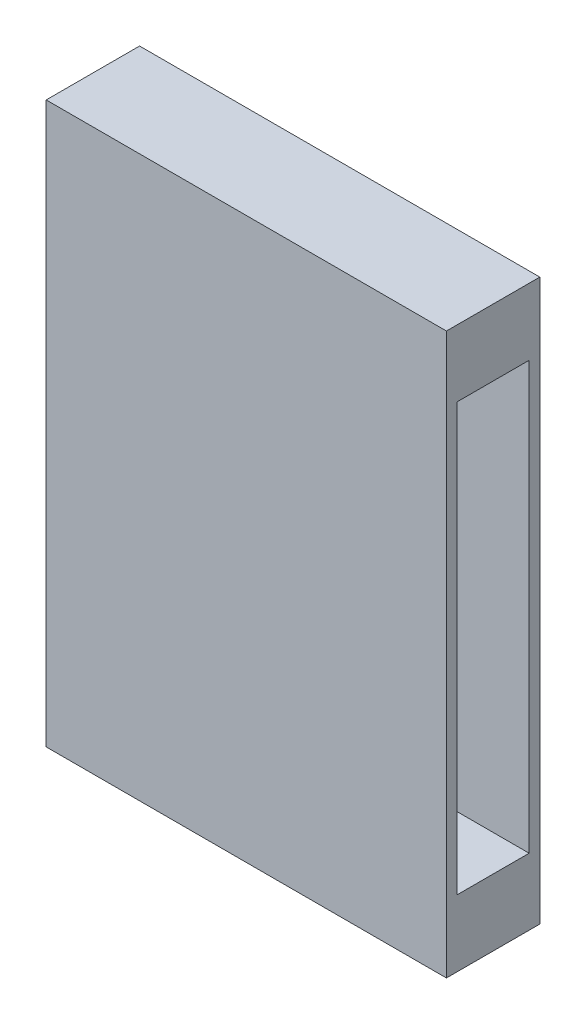
ISO-10303-21;
HEADER;
FILE_DESCRIPTION(('STEP AP214'),'2;1');
FILE_NAME('part.step','',(''),(''),'','','');
FILE_SCHEMA(('AUTOMOTIVE_DESIGN { 1 0 10303 214 1 1 1 1 }'));
ENDSEC;
DATA;
#1=APPLICATION_CONTEXT('core data for automotive mechanical design processes');
#2=APPLICATION_PROTOCOL_DEFINITION('international standard','automotive_design',2000,#1);
#3=PRODUCT_CONTEXT('',#1,'mechanical');
#4=PRODUCT('Part','Part','',(#3));
#5=PRODUCT_RELATED_PRODUCT_CATEGORY('part','',(#4));
#6=PRODUCT_DEFINITION_FORMATION('','',#4);
#7=PRODUCT_DEFINITION_CONTEXT('part definition',#1,'design');
#8=PRODUCT_DEFINITION('design','',#6,#7);
#9=PRODUCT_DEFINITION_SHAPE('','',#8);
#10=(LENGTH_UNIT() NAMED_UNIT(*) SI_UNIT(.MILLI.,.METRE.));
#11=(NAMED_UNIT(*) PLANE_ANGLE_UNIT() SI_UNIT($,.RADIAN.));
#12=(NAMED_UNIT(*) SI_UNIT($,.STERADIAN.) SOLID_ANGLE_UNIT());
#13=UNCERTAINTY_MEASURE_WITH_UNIT(LENGTH_MEASURE(1.E-05),#10,'distance_accuracy_value','');
#14=(GEOMETRIC_REPRESENTATION_CONTEXT(3) GLOBAL_UNCERTAINTY_ASSIGNED_CONTEXT((#13)) GLOBAL_UNIT_ASSIGNED_CONTEXT((#10,
#11,#12)) REPRESENTATION_CONTEXT('',''));
#15=CARTESIAN_POINT('',(0.,0.,0.));
#16=DIRECTION('',(0.,0.,1.));
#17=DIRECTION('',(1.,0.,0.));
#18=AXIS2_PLACEMENT_3D('',#15,#16,#17);
#19=CARTESIAN_POINT('',(21.,0.,0.));
#20=DIRECTION('',(-1.,0.,0.));
#21=DIRECTION('',(0.,0.,1.));
#22=AXIS2_PLACEMENT_3D('',#19,#20,#21);
#23=PLANE('',#22);
#24=DIRECTION('',(0.,0.,-1.));
#25=VECTOR('',#24,1.);
#26=CARTESIAN_POINT('',(21.,37.,0.));
#27=LINE('',#26,#25);
#28=CARTESIAN_POINT('',(21.,37.,6.2));
#29=VERTEX_POINT('',#28);
#30=CARTESIAN_POINT('',(21.,37.,0.800000000000005));
#31=VERTEX_POINT('',#30);
#32=EDGE_CURVE('E11',#29,#31,#27,.T.);
#33=ORIENTED_EDGE('',*,*,#32,.F.);
#34=DIRECTION('',(0.,1.,0.));
#35=VECTOR('',#34,1.);
#36=CARTESIAN_POINT('',(21.,0.8,6.2));
#37=LINE('',#36,#35);
#38=CARTESIAN_POINT('',(21.,41.2,6.2));
#39=VERTEX_POINT('',#38);
#40=EDGE_CURVE('E162',#29,#39,#37,.T.);
#41=ORIENTED_EDGE('',*,*,#40,.T.);
#42=DIRECTION('',(0.,0.,-1.));
#43=VECTOR('',#42,1.);
#44=CARTESIAN_POINT('',(21.,41.2,6.2));
#45=LINE('',#44,#43);
#46=CARTESIAN_POINT('',(21.,41.2,0.8));
#47=VERTEX_POINT('',#46);
#48=EDGE_CURVE('E152',#39,#47,#45,.T.);
#49=ORIENTED_EDGE('',*,*,#48,.T.);
#50=DIRECTION('',(0.,-1.,0.));
#51=VECTOR('',#50,1.);
#52=CARTESIAN_POINT('',(21.,41.2,0.8));
#53=LINE('',#52,#51);
#54=EDGE_CURVE('E156',#47,#31,#53,.T.);
#55=ORIENTED_EDGE('',*,*,#54,.T.);
#56=EDGE_LOOP('',(#33,#41,#49,#55));
#57=FACE_BOUND('',#56,.T.);
#58=ADVANCED_FACE('F35',(#57),#23,.T.);
#59=CARTESIAN_POINT('',(0.,0.,7.));
#60=DIRECTION('',(1.,0.,0.));
#61=DIRECTION('',(0.,0.,-1.));
#62=AXIS2_PLACEMENT_3D('',#59,#60,#61);
#63=PLANE('',#62);
#64=DIRECTION('',(0.,-1.,0.));
#65=VECTOR('',#64,1.);
#66=CARTESIAN_POINT('',(0.,41.2,0.8));
#67=LINE('',#66,#65);
#68=CARTESIAN_POINT('',(0.,41.2,0.799999999999999));
#69=VERTEX_POINT('',#68);
#70=CARTESIAN_POINT('',(0.,0.8,0.8));
#71=VERTEX_POINT('',#70);
#72=EDGE_CURVE('E168',#69,#71,#67,.T.);
#73=ORIENTED_EDGE('',*,*,#72,.F.);
#74=DIRECTION('',(0.,0.,-1.));
#75=VECTOR('',#74,1.);
#76=CARTESIAN_POINT('',(0.,41.2,6.2));
#77=LINE('',#76,#75);
#78=CARTESIAN_POINT('',(0.,41.2,6.2));
#79=VERTEX_POINT('',#78);
#80=EDGE_CURVE('E149',#79,#69,#77,.T.);
#81=ORIENTED_EDGE('',*,*,#80,.F.);
#82=DIRECTION('',(0.,1.,0.));
#83=VECTOR('',#82,1.);
#84=CARTESIAN_POINT('',(0.,0.8,6.2));
#85=LINE('',#84,#83);
#86=CARTESIAN_POINT('',(0.,0.8,6.2));
#87=VERTEX_POINT('',#86);
#88=EDGE_CURVE('E155',#87,#79,#85,.T.);
#89=ORIENTED_EDGE('',*,*,#88,.F.);
#90=DIRECTION('',(0.,0.,1.));
#91=VECTOR('',#90,1.);
#92=CARTESIAN_POINT('',(0.,0.8,0.8));
#93=LINE('',#92,#91);
#94=EDGE_CURVE('E171',#71,#87,#93,.T.);
#95=ORIENTED_EDGE('',*,*,#94,.F.);
#96=EDGE_LOOP('',(#73,#81,#89,#95));
#97=FACE_BOUND('',#96,.T.);
#98=DIRECTION('',(0.,-1.,0.));
#99=VECTOR('',#98,1.);
#100=CARTESIAN_POINT('',(0.,0.,0.));
#101=LINE('',#100,#99);
#102=CARTESIAN_POINT('',(0.,42.,0.));
#103=VERTEX_POINT('',#102);
#104=CARTESIAN_POINT('',(0.,0.,0.));
#105=VERTEX_POINT('',#104);
#106=EDGE_CURVE('E178',#103,#105,#101,.T.);
#107=ORIENTED_EDGE('',*,*,#106,.T.);
#108=DIRECTION('',(0.,0.,-1.));
#109=VECTOR('',#108,1.);
#110=CARTESIAN_POINT('',(0.,0.,7.));
#111=LINE('',#110,#109);
#112=CARTESIAN_POINT('',(0.,0.,7.));
#113=VERTEX_POINT('',#112);
#114=EDGE_CURVE('E211',#113,#105,#111,.T.);
#115=ORIENTED_EDGE('',*,*,#114,.F.);
#116=DIRECTION('',(0.,-1.,0.));
#117=VECTOR('',#116,1.);
#118=CARTESIAN_POINT('',(0.,0.,7.));
#119=LINE('',#118,#117);
#120=CARTESIAN_POINT('',(0.,42.,7.));
#121=VERTEX_POINT('',#120);
#122=EDGE_CURVE('E185',#121,#113,#119,.T.);
#123=ORIENTED_EDGE('',*,*,#122,.F.);
#124=DIRECTION('',(0.,0.,-1.));
#125=VECTOR('',#124,1.);
#126=CARTESIAN_POINT('',(0.,42.,7.));
#127=LINE('',#126,#125);
#128=EDGE_CURVE('E195',#121,#103,#127,.T.);
#129=ORIENTED_EDGE('',*,*,#128,.T.);
#130=EDGE_LOOP('',(#107,#115,#123,#129));
#131=FACE_BOUND('',#130,.T.);
#132=ADVANCED_FACE('F37',(#97,#131),#63,.F.);
#133=CARTESIAN_POINT('',(0.,0.,7.));
#134=DIRECTION('',(0.,1.,0.));
#135=DIRECTION('',(0.,0.,1.));
#136=AXIS2_PLACEMENT_3D('',#133,#134,#135);
#137=PLANE('',#136);
#138=DIRECTION('',(1.,0.,0.));
#139=VECTOR('',#138,1.);
#140=CARTESIAN_POINT('',(0.,0.,0.));
#141=LINE('',#140,#139);
#142=CARTESIAN_POINT('',(30.,0.,0.));
#143=VERTEX_POINT('',#142);
#144=EDGE_CURVE('E198',#105,#143,#141,.T.);
#145=ORIENTED_EDGE('',*,*,#144,.T.);
#146=DIRECTION('',(0.,0.,-1.));
#147=VECTOR('',#146,1.);
#148=CARTESIAN_POINT('',(30.,0.,7.));
#149=LINE('',#148,#147);
#150=CARTESIAN_POINT('',(30.,0.,7.));
#151=VERTEX_POINT('',#150);
#152=EDGE_CURVE('E208',#151,#143,#149,.T.);
#153=ORIENTED_EDGE('',*,*,#152,.F.);
#154=DIRECTION('',(1.,0.,0.));
#155=VECTOR('',#154,1.);
#156=CARTESIAN_POINT('',(0.,0.,7.));
#157=LINE('',#156,#155);
#158=EDGE_CURVE('E188',#113,#151,#157,.T.);
#159=ORIENTED_EDGE('',*,*,#158,.F.);
#160=ORIENTED_EDGE('',*,*,#114,.T.);
#161=EDGE_LOOP('',(#145,#153,#159,#160));
#162=FACE_BOUND('',#161,.T.);
#163=ADVANCED_FACE('F248',(#162),#137,.F.);
#164=CARTESIAN_POINT('',(30.,0.,7.));
#165=DIRECTION('',(-1.,0.,0.));
#166=DIRECTION('',(0.,0.,1.));
#167=AXIS2_PLACEMENT_3D('',#164,#165,#166);
#168=PLANE('',#167);
#169=DIRECTION('',(0.,0.,-1.));
#170=VECTOR('',#169,1.);
#171=CARTESIAN_POINT('',(30.,5.,6.2));
#172=LINE('',#171,#170);
#173=CARTESIAN_POINT('',(30.,5.,6.2));
#174=VERTEX_POINT('',#173);
#175=CARTESIAN_POINT('',(30.,5.,0.800000000000005));
#176=VERTEX_POINT('',#175);
#177=EDGE_CURVE('E135',#174,#176,#172,.T.);
#178=ORIENTED_EDGE('',*,*,#177,.F.);
#179=DIRECTION('',(0.,-1.,0.));
#180=VECTOR('',#179,1.);
#181=CARTESIAN_POINT('',(30.,37.,6.2));
#182=LINE('',#181,#180);
#183=CARTESIAN_POINT('',(30.,37.,6.2));
#184=VERTEX_POINT('',#183);
#185=EDGE_CURVE('E50',#184,#174,#182,.T.);
#186=ORIENTED_EDGE('',*,*,#185,.F.);
#187=DIRECTION('',(0.,0.,1.));
#188=VECTOR('',#187,1.);
#189=CARTESIAN_POINT('',(30.,37.,6.2));
#190=LINE('',#189,#188);
#191=CARTESIAN_POINT('',(30.,37.,0.800000000000005));
#192=VERTEX_POINT('',#191);
#193=EDGE_CURVE('E142',#192,#184,#190,.T.);
#194=ORIENTED_EDGE('',*,*,#193,.F.);
#195=DIRECTION('',(0.,1.,0.));
#196=VECTOR('',#195,1.);
#197=CARTESIAN_POINT('',(30.,37.,0.800000000000005));
#198=LINE('',#197,#196);
#199=EDGE_CURVE('E127',#176,#192,#198,.T.);
#200=ORIENTED_EDGE('',*,*,#199,.F.);
#201=EDGE_LOOP('',(#178,#186,#194,#200));
#202=FACE_BOUND('',#201,.T.);
#203=DIRECTION('',(0.,1.,0.));
#204=VECTOR('',#203,1.);
#205=CARTESIAN_POINT('',(30.,0.,0.));
#206=LINE('',#205,#204);
#207=CARTESIAN_POINT('',(30.,42.,0.));
#208=VERTEX_POINT('',#207);
#209=EDGE_CURVE('E200',#143,#208,#206,.T.);
#210=ORIENTED_EDGE('',*,*,#209,.T.);
#211=DIRECTION('',(0.,0.,-1.));
#212=VECTOR('',#211,1.);
#213=CARTESIAN_POINT('',(30.,42.,7.));
#214=LINE('',#213,#212);
#215=CARTESIAN_POINT('',(30.,42.,7.));
#216=VERTEX_POINT('',#215);
#217=EDGE_CURVE('E205',#216,#208,#214,.T.);
#218=ORIENTED_EDGE('',*,*,#217,.F.);
#219=DIRECTION('',(0.,1.,0.));
#220=VECTOR('',#219,1.);
#221=CARTESIAN_POINT('',(30.,0.,7.));
#222=LINE('',#221,#220);
#223=EDGE_CURVE('E191',#151,#216,#222,.T.);
#224=ORIENTED_EDGE('',*,*,#223,.F.);
#225=ORIENTED_EDGE('',*,*,#152,.T.);
#226=EDGE_LOOP('',(#210,#218,#224,#225));
#227=FACE_BOUND('',#226,.T.);
#228=ADVANCED_FACE('F139',(#202,#227),#168,.F.);
#229=CARTESIAN_POINT('',(0.,42.,7.));
#230=DIRECTION('',(0.,-1.,0.));
#231=DIRECTION('',(0.,0.,-1.));
#232=AXIS2_PLACEMENT_3D('',#229,#230,#231);
#233=PLANE('',#232);
#234=DIRECTION('',(-1.,0.,0.));
#235=VECTOR('',#234,1.);
#236=CARTESIAN_POINT('',(0.,42.,0.));
#237=LINE('',#236,#235);
#238=EDGE_CURVE('E189',#208,#103,#237,.T.);
#239=ORIENTED_EDGE('',*,*,#238,.T.);
#240=ORIENTED_EDGE('',*,*,#128,.F.);
#241=DIRECTION('',(-1.,0.,0.));
#242=VECTOR('',#241,1.);
#243=CARTESIAN_POINT('',(0.,42.,7.));
#244=LINE('',#243,#242);
#245=EDGE_CURVE('E193',#216,#121,#244,.T.);
#246=ORIENTED_EDGE('',*,*,#245,.F.);
#247=ORIENTED_EDGE('',*,*,#217,.T.);
#248=EDGE_LOOP('',(#239,#240,#246,#247));
#249=FACE_BOUND('',#248,.T.);
#250=ADVANCED_FACE('F262',(#249),#233,.F.);
#251=CARTESIAN_POINT('',(0.,0.,7.));
#252=DIRECTION('',(0.,0.,-1.));
#253=DIRECTION('',(-1.,0.,0.));
#254=AXIS2_PLACEMENT_3D('',#251,#252,#253);
#255=PLANE('',#254);
#256=ORIENTED_EDGE('',*,*,#122,.T.);
#257=ORIENTED_EDGE('',*,*,#158,.T.);
#258=ORIENTED_EDGE('',*,*,#223,.T.);
#259=ORIENTED_EDGE('',*,*,#245,.T.);
#260=EDGE_LOOP('',(#256,#257,#258,#259));
#261=FACE_BOUND('',#260,.T.);
#262=ADVANCED_FACE('F259',(#261),#255,.F.);
#263=CARTESIAN_POINT('',(0.,0.,0.));
#264=DIRECTION('',(0.,0.,-1.));
#265=DIRECTION('',(-1.,0.,0.));
#266=AXIS2_PLACEMENT_3D('',#263,#264,#265);
#267=PLANE('',#266);
#268=ORIENTED_EDGE('',*,*,#106,.F.);
#269=ORIENTED_EDGE('',*,*,#238,.F.);
#270=ORIENTED_EDGE('',*,*,#209,.F.);
#271=ORIENTED_EDGE('',*,*,#144,.F.);
#272=EDGE_LOOP('',(#268,#269,#270,#271));
#273=FACE_BOUND('',#272,.T.);
#274=ADVANCED_FACE('F258',(#273),#267,.T.);
#275=CARTESIAN_POINT('',(21.,41.2,6.2));
#276=DIRECTION('',(0.,1.,0.));
#277=DIRECTION('',(0.,0.,1.));
#278=AXIS2_PLACEMENT_3D('',#275,#276,#277);
#279=PLANE('',#278);
#280=ORIENTED_EDGE('',*,*,#80,.T.);
#281=DIRECTION('',(-1.,0.,0.));
#282=VECTOR('',#281,1.);
#283=CARTESIAN_POINT('',(21.,41.2,0.8));
#284=LINE('',#283,#282);
#285=EDGE_CURVE('E166',#47,#69,#284,.T.);
#286=ORIENTED_EDGE('',*,*,#285,.F.);
#287=ORIENTED_EDGE('',*,*,#48,.F.);
#288=DIRECTION('',(-1.,0.,0.));
#289=VECTOR('',#288,1.);
#290=CARTESIAN_POINT('',(21.,41.2,6.2));
#291=LINE('',#290,#289);
#292=EDGE_CURVE('E176',#39,#79,#291,.T.);
#293=ORIENTED_EDGE('',*,*,#292,.T.);
#294=EDGE_LOOP('',(#280,#286,#287,#293));
#295=FACE_BOUND('',#294,.T.);
#296=ADVANCED_FACE('F230',(#295),#279,.F.);
#297=CARTESIAN_POINT('',(21.,0.8,6.2));
#298=DIRECTION('',(0.,0.,1.));
#299=DIRECTION('',(1.,0.,0.));
#300=AXIS2_PLACEMENT_3D('',#297,#298,#299);
#301=PLANE('',#300);
#302=DIRECTION('',(1.,0.,0.));
#303=VECTOR('',#302,1.);
#304=CARTESIAN_POINT('',(9.,5.,6.2));
#305=LINE('',#304,#303);
#306=CARTESIAN_POINT('',(21.,5.,6.2));
#307=VERTEX_POINT('',#306);
#308=EDGE_CURVE('E132',#307,#174,#305,.T.);
#309=ORIENTED_EDGE('',*,*,#308,.F.);
#310=CARTESIAN_POINT('',(21.,0.8,6.2));
#311=VERTEX_POINT('',#310);
#312=EDGE_CURVE('E163',#311,#307,#37,.T.);
#313=ORIENTED_EDGE('',*,*,#312,.F.);
#314=DIRECTION('',(-1.,0.,0.));
#315=VECTOR('',#314,1.);
#316=CARTESIAN_POINT('',(21.,0.8,6.2));
#317=LINE('',#316,#315);
#318=EDGE_CURVE('E179',#311,#87,#317,.T.);
#319=ORIENTED_EDGE('',*,*,#318,.T.);
#320=ORIENTED_EDGE('',*,*,#88,.T.);
#321=ORIENTED_EDGE('',*,*,#292,.F.);
#322=ORIENTED_EDGE('',*,*,#40,.F.);
#323=DIRECTION('',(1.,0.,0.));
#324=VECTOR('',#323,1.);
#325=CARTESIAN_POINT('',(9.,37.,6.2));
#326=LINE('',#325,#324);
#327=EDGE_CURVE('E147',#29,#184,#326,.T.);
#328=ORIENTED_EDGE('',*,*,#327,.T.);
#329=ORIENTED_EDGE('',*,*,#185,.T.);
#330=EDGE_LOOP('',(#309,#313,#319,#320,#321,#322,#328,#329));
#331=FACE_BOUND('',#330,.T.);
#332=ADVANCED_FACE('F215',(#331),#301,.F.);
#333=CARTESIAN_POINT('',(21.,0.8,0.8));
#334=DIRECTION('',(0.,-1.,0.));
#335=DIRECTION('',(0.,0.,-1.));
#336=AXIS2_PLACEMENT_3D('',#333,#334,#335);
#337=PLANE('',#336);
#338=ORIENTED_EDGE('',*,*,#94,.T.);
#339=ORIENTED_EDGE('',*,*,#318,.F.);
#340=DIRECTION('',(0.,0.,1.));
#341=VECTOR('',#340,1.);
#342=CARTESIAN_POINT('',(21.,0.8,0.8));
#343=LINE('',#342,#341);
#344=CARTESIAN_POINT('',(21.,0.8,0.8));
#345=VERTEX_POINT('',#344);
#346=EDGE_CURVE('E159',#345,#311,#343,.T.);
#347=ORIENTED_EDGE('',*,*,#346,.F.);
#348=DIRECTION('',(-1.,0.,0.));
#349=VECTOR('',#348,1.);
#350=CARTESIAN_POINT('',(21.,0.8,0.8));
#351=LINE('',#350,#349);
#352=EDGE_CURVE('E181',#345,#71,#351,.T.);
#353=ORIENTED_EDGE('',*,*,#352,.T.);
#354=EDGE_LOOP('',(#338,#339,#347,#353));
#355=FACE_BOUND('',#354,.T.);
#356=ADVANCED_FACE('F219',(#355),#337,.F.);
#357=CARTESIAN_POINT('',(21.,41.2,0.8));
#358=DIRECTION('',(0.,0.,-1.));
#359=DIRECTION('',(0.,1.,0.));
#360=AXIS2_PLACEMENT_3D('',#357,#358,#359);
#361=PLANE('',#360);
#362=DIRECTION('',(1.,0.,0.));
#363=VECTOR('',#362,1.);
#364=CARTESIAN_POINT('',(9.,37.,0.800000000000005));
#365=LINE('',#364,#363);
#366=EDGE_CURVE('E131',#31,#192,#365,.T.);
#367=ORIENTED_EDGE('',*,*,#366,.F.);
#368=ORIENTED_EDGE('',*,*,#54,.F.);
#369=ORIENTED_EDGE('',*,*,#285,.T.);
#370=ORIENTED_EDGE('',*,*,#72,.T.);
#371=ORIENTED_EDGE('',*,*,#352,.F.);
#372=CARTESIAN_POINT('',(21.,5.,0.8));
#373=VERTEX_POINT('',#372);
#374=EDGE_CURVE('E130',#373,#345,#53,.T.);
#375=ORIENTED_EDGE('',*,*,#374,.F.);
#376=DIRECTION('',(1.,0.,0.));
#377=VECTOR('',#376,1.);
#378=CARTESIAN_POINT('',(9.,5.,0.800000000000005));
#379=LINE('',#378,#377);
#380=EDGE_CURVE('E58',#373,#176,#379,.T.);
#381=ORIENTED_EDGE('',*,*,#380,.T.);
#382=ORIENTED_EDGE('',*,*,#199,.T.);
#383=EDGE_LOOP('',(#367,#368,#369,#370,#371,#375,#381,#382));
#384=FACE_BOUND('',#383,.T.);
#385=ADVANCED_FACE('F125',(#384),#361,.F.);
#386=DIRECTION('',(0.,0.,1.));
#387=VECTOR('',#386,1.);
#388=CARTESIAN_POINT('',(21.,5.,0.));
#389=LINE('',#388,#387);
#390=EDGE_CURVE('E43',#373,#307,#389,.T.);
#391=ORIENTED_EDGE('',*,*,#390,.F.);
#392=ORIENTED_EDGE('',*,*,#374,.T.);
#393=ORIENTED_EDGE('',*,*,#346,.T.);
#394=ORIENTED_EDGE('',*,*,#312,.T.);
#395=EDGE_LOOP('',(#391,#392,#393,#394));
#396=FACE_BOUND('',#395,.T.);
#397=ADVANCED_FACE('F216',(#396),#23,.T.);
#398=CARTESIAN_POINT('',(9.,37.,6.2));
#399=DIRECTION('',(0.,1.,0.));
#400=DIRECTION('',(0.,0.,1.));
#401=AXIS2_PLACEMENT_3D('',#398,#399,#400);
#402=PLANE('',#401);
#403=ORIENTED_EDGE('',*,*,#32,.T.);
#404=ORIENTED_EDGE('',*,*,#366,.T.);
#405=ORIENTED_EDGE('',*,*,#193,.T.);
#406=ORIENTED_EDGE('',*,*,#327,.F.);
#407=EDGE_LOOP('',(#403,#404,#405,#406));
#408=FACE_BOUND('',#407,.T.);
#409=ADVANCED_FACE('F235',(#408),#402,.F.);
#410=CARTESIAN_POINT('',(9.,5.,6.2));
#411=DIRECTION('',(0.,-1.,0.));
#412=DIRECTION('',(0.,0.,-1.));
#413=AXIS2_PLACEMENT_3D('',#410,#411,#412);
#414=PLANE('',#413);
#415=ORIENTED_EDGE('',*,*,#390,.T.);
#416=ORIENTED_EDGE('',*,*,#308,.T.);
#417=ORIENTED_EDGE('',*,*,#177,.T.);
#418=ORIENTED_EDGE('',*,*,#380,.F.);
#419=EDGE_LOOP('',(#415,#416,#417,#418));
#420=FACE_BOUND('',#419,.T.);
#421=ADVANCED_FACE('F136',(#420),#414,.F.);
#422=CLOSED_SHELL('',(#58,#132,#163,#228,#250,#262,#274,#296,#332,#356,#385,#397,#409,#421));
#423=MANIFOLD_SOLID_BREP('B2',#422);
#424=ADVANCED_BREP_SHAPE_REPRESENTATION('',(#18,#423),#14);
#425=SHAPE_DEFINITION_REPRESENTATION(#9,#424);
ENDSEC;
END-ISO-10303-21;
